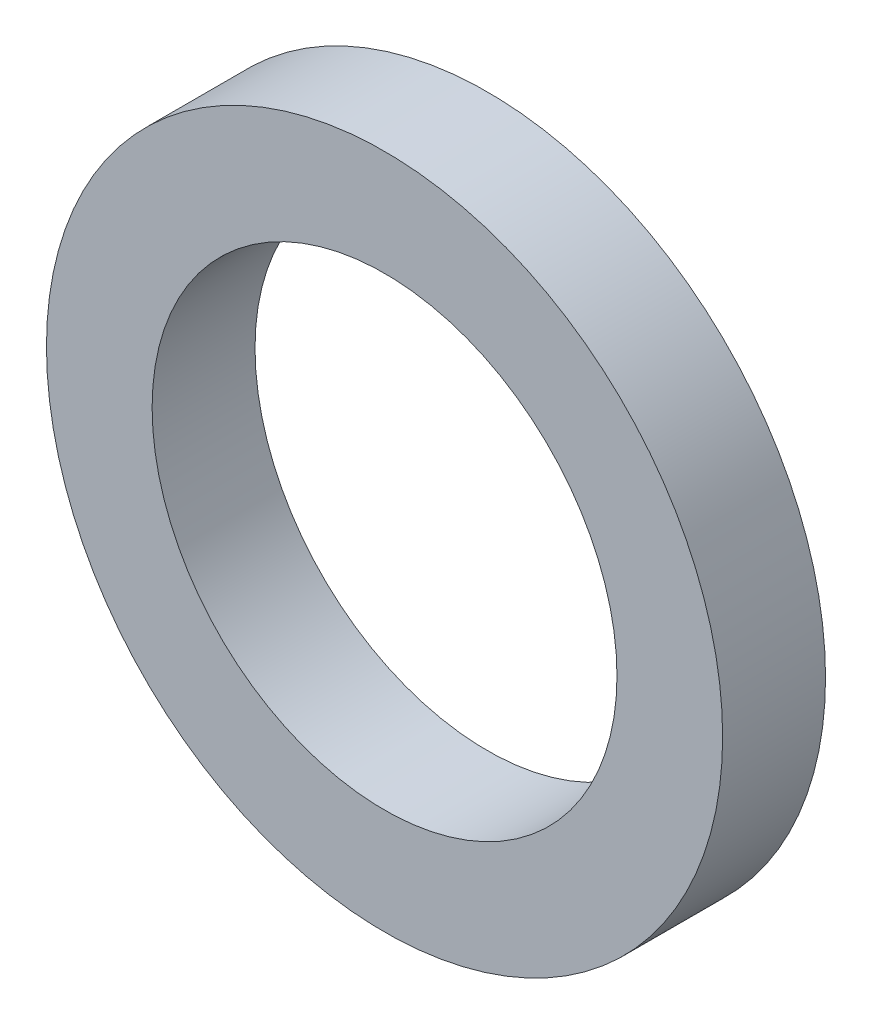
ISO-10303-21;
HEADER;
FILE_DESCRIPTION(('STEP AP214'),'2;1');
FILE_NAME('part.step','',(''),(''),'','','');
FILE_SCHEMA(('AUTOMOTIVE_DESIGN { 1 0 10303 214 1 1 1 1 }'));
ENDSEC;
DATA;
#1=APPLICATION_CONTEXT('core data for automotive mechanical design processes');
#2=APPLICATION_PROTOCOL_DEFINITION('international standard','automotive_design',2000,#1);
#3=PRODUCT_CONTEXT('',#1,'mechanical');
#4=PRODUCT('Part','Part','',(#3));
#5=PRODUCT_RELATED_PRODUCT_CATEGORY('part','',(#4));
#6=PRODUCT_DEFINITION_FORMATION('','',#4);
#7=PRODUCT_DEFINITION_CONTEXT('part definition',#1,'design');
#8=PRODUCT_DEFINITION('design','',#6,#7);
#9=PRODUCT_DEFINITION_SHAPE('','',#8);
#10=(LENGTH_UNIT() NAMED_UNIT(*) SI_UNIT(.MILLI.,.METRE.));
#11=(NAMED_UNIT(*) PLANE_ANGLE_UNIT() SI_UNIT($,.RADIAN.));
#12=(NAMED_UNIT(*) SI_UNIT($,.STERADIAN.) SOLID_ANGLE_UNIT());
#13=UNCERTAINTY_MEASURE_WITH_UNIT(LENGTH_MEASURE(1.E-05),#10,'distance_accuracy_value','');
#14=(GEOMETRIC_REPRESENTATION_CONTEXT(3) GLOBAL_UNCERTAINTY_ASSIGNED_CONTEXT((#13)) GLOBAL_UNIT_ASSIGNED_CONTEXT((#10,
#11,#12)) REPRESENTATION_CONTEXT('',''));
#15=CARTESIAN_POINT('',(0.,0.,0.));
#16=DIRECTION('',(0.,0.,1.));
#17=DIRECTION('',(1.,0.,0.));
#18=AXIS2_PLACEMENT_3D('',#15,#16,#17);
#19=CARTESIAN_POINT('',(0.,0.,2.8));
#20=DIRECTION('',(0.,0.,1.));
#21=DIRECTION('',(1.,0.,0.));
#22=AXIS2_PLACEMENT_3D('',#19,#20,#21);
#23=PLANE('',#22);
#24=CARTESIAN_POINT('',(0.,0.,2.8));
#25=DIRECTION('',(0.,0.,1.));
#26=DIRECTION('',(1.,0.,0.));
#27=AXIS2_PLACEMENT_3D('',#24,#25,#26);
#28=CIRCLE('',#27,9.2);
#29=CARTESIAN_POINT('',(9.2,0.,2.8));
#30=VERTEX_POINT('',#29);
#31=EDGE_CURVE('E10',#30,#30,#28,.T.);
#32=ORIENTED_EDGE('',*,*,#31,.T.);
#33=EDGE_LOOP('',(#32));
#34=FACE_BOUND('',#33,.T.);
#35=CARTESIAN_POINT('',(0.,0.,2.8));
#36=DIRECTION('',(0.,0.,1.));
#37=DIRECTION('',(1.,0.,0.));
#38=AXIS2_PLACEMENT_3D('',#35,#36,#37);
#39=CIRCLE('',#38,6.325);
#40=CARTESIAN_POINT('',(6.325,0.,2.8));
#41=VERTEX_POINT('',#40);
#42=EDGE_CURVE('E44',#41,#41,#39,.T.);
#43=ORIENTED_EDGE('',*,*,#42,.F.);
#44=EDGE_LOOP('',(#43));
#45=FACE_BOUND('',#44,.T.);
#46=ADVANCED_FACE('F33',(#34,#45),#23,.T.);
#47=CARTESIAN_POINT('',(0.,0.,0.));
#48=DIRECTION('',(0.,0.,1.));
#49=DIRECTION('',(1.,0.,0.));
#50=AXIS2_PLACEMENT_3D('',#47,#48,#49);
#51=PLANE('',#50);
#52=CARTESIAN_POINT('',(0.,0.,0.));
#53=DIRECTION('',(0.,0.,1.));
#54=DIRECTION('',(1.,0.,0.));
#55=AXIS2_PLACEMENT_3D('',#52,#53,#54);
#56=CIRCLE('',#55,9.2);
#57=CARTESIAN_POINT('',(9.2,0.,0.));
#58=VERTEX_POINT('',#57);
#59=EDGE_CURVE('E37',#58,#58,#56,.T.);
#60=ORIENTED_EDGE('',*,*,#59,.F.);
#61=EDGE_LOOP('',(#60));
#62=FACE_BOUND('',#61,.T.);
#63=CARTESIAN_POINT('',(0.,0.,0.));
#64=DIRECTION('',(0.,0.,1.));
#65=DIRECTION('',(1.,0.,0.));
#66=AXIS2_PLACEMENT_3D('',#63,#64,#65);
#67=CIRCLE('',#66,6.325);
#68=CARTESIAN_POINT('',(6.325,0.,0.));
#69=VERTEX_POINT('',#68);
#70=EDGE_CURVE('E46',#69,#69,#67,.T.);
#71=ORIENTED_EDGE('',*,*,#70,.T.);
#72=EDGE_LOOP('',(#71));
#73=FACE_BOUND('',#72,.T.);
#74=ADVANCED_FACE('F56',(#62,#73),#51,.F.);
#75=CARTESIAN_POINT('',(0.,0.,2.8));
#76=DIRECTION('',(0.,0.,-1.));
#77=DIRECTION('',(-1.,0.,0.));
#78=AXIS2_PLACEMENT_3D('',#75,#76,#77);
#79=CYLINDRICAL_SURFACE('',#78,9.2);
#80=ORIENTED_EDGE('',*,*,#31,.F.);
#81=EDGE_LOOP('',(#80));
#82=FACE_BOUND('',#81,.T.);
#83=ORIENTED_EDGE('',*,*,#59,.T.);
#84=EDGE_LOOP('',(#83));
#85=FACE_BOUND('',#84,.T.);
#86=ADVANCED_FACE('F35',(#82,#85),#79,.T.);
#87=CARTESIAN_POINT('',(0.,0.,2.8));
#88=DIRECTION('',(0.,0.,-1.));
#89=DIRECTION('',(-1.,0.,0.));
#90=AXIS2_PLACEMENT_3D('',#87,#88,#89);
#91=CYLINDRICAL_SURFACE('',#90,6.325);
#92=ORIENTED_EDGE('',*,*,#42,.T.);
#93=EDGE_LOOP('',(#92));
#94=FACE_BOUND('',#93,.T.);
#95=ORIENTED_EDGE('',*,*,#70,.F.);
#96=EDGE_LOOP('',(#95));
#97=FACE_BOUND('',#96,.T.);
#98=ADVANCED_FACE('F52',(#94,#97),#91,.F.);
#99=CLOSED_SHELL('',(#46,#74,#86,#98));
#100=MANIFOLD_SOLID_BREP('B2',#99);
#101=ADVANCED_BREP_SHAPE_REPRESENTATION('',(#18,#100),#14);
#102=SHAPE_DEFINITION_REPRESENTATION(#9,#101);
ENDSEC;
END-ISO-10303-21;
